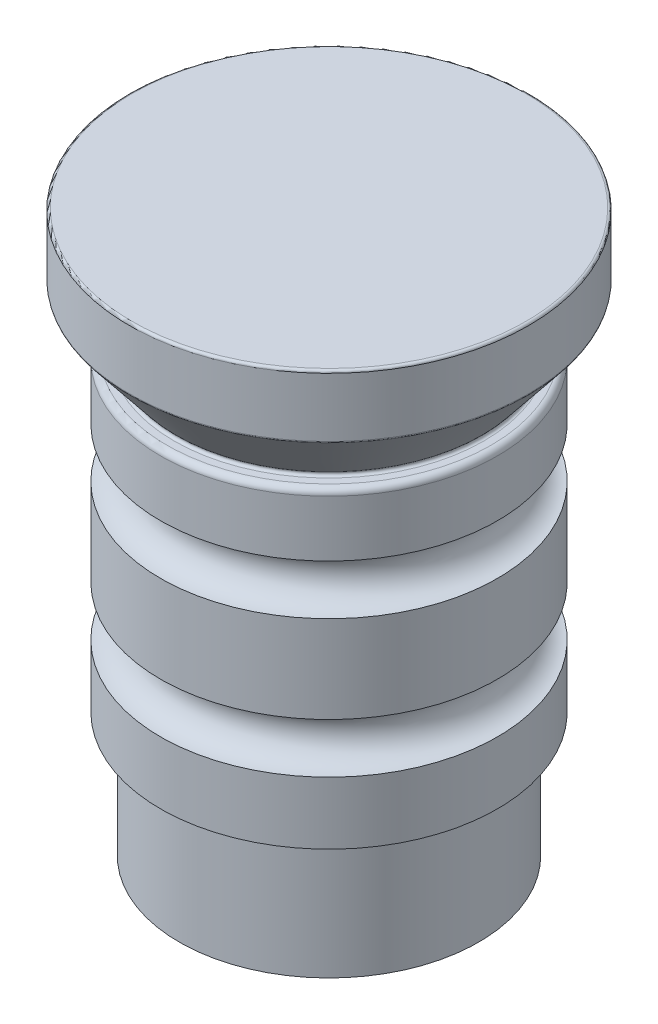
ISO-10303-21;
HEADER;
FILE_DESCRIPTION(('STEP AP214'),'2;1');
FILE_NAME('part.step','',(''),(''),'','','');
FILE_SCHEMA(('AUTOMOTIVE_DESIGN { 1 0 10303 214 1 1 1 1 }'));
ENDSEC;
DATA;
#1=APPLICATION_CONTEXT('core data for automotive mechanical design processes');
#2=APPLICATION_PROTOCOL_DEFINITION('international standard','automotive_design',2000,#1);
#3=PRODUCT_CONTEXT('',#1,'mechanical');
#4=PRODUCT('Part','Part','',(#3));
#5=PRODUCT_RELATED_PRODUCT_CATEGORY('part','',(#4));
#6=PRODUCT_DEFINITION_FORMATION('','',#4);
#7=PRODUCT_DEFINITION_CONTEXT('part definition',#1,'design');
#8=PRODUCT_DEFINITION('design','',#6,#7);
#9=PRODUCT_DEFINITION_SHAPE('','',#8);
#10=(LENGTH_UNIT() NAMED_UNIT(*) SI_UNIT(.MILLI.,.METRE.));
#11=(NAMED_UNIT(*) PLANE_ANGLE_UNIT() SI_UNIT($,.RADIAN.));
#12=(NAMED_UNIT(*) SI_UNIT($,.STERADIAN.) SOLID_ANGLE_UNIT());
#13=UNCERTAINTY_MEASURE_WITH_UNIT(LENGTH_MEASURE(1.E-05),#10,'distance_accuracy_value','');
#14=(GEOMETRIC_REPRESENTATION_CONTEXT(3) GLOBAL_UNCERTAINTY_ASSIGNED_CONTEXT((#13)) GLOBAL_UNIT_ASSIGNED_CONTEXT((#10,
#11,#12)) REPRESENTATION_CONTEXT('',''));
#15=CARTESIAN_POINT('',(0.,0.,0.));
#16=DIRECTION('',(0.,0.,1.));
#17=DIRECTION('',(1.,0.,0.));
#18=AXIS2_PLACEMENT_3D('',#15,#16,#17);
#19=CARTESIAN_POINT('',(-16.,45.,0.));
#20=DIRECTION('',(0.,1.,0.));
#21=DIRECTION('',(-1.,0.,0.));
#22=AXIS2_PLACEMENT_3D('',#19,#20,#21);
#23=PLANE('',#22);
#24=CARTESIAN_POINT('',(0.,45.,0.));
#25=DIRECTION('',(0.,1.,0.));
#26=DIRECTION('',(-1.,0.,0.));
#27=AXIS2_PLACEMENT_3D('',#24,#25,#26);
#28=CIRCLE('',#27,15.8);
#29=CARTESIAN_POINT('',(-15.8,45.,0.));
#30=VERTEX_POINT('',#29);
#31=EDGE_CURVE('E83',#30,#30,#28,.T.);
#32=ORIENTED_EDGE('',*,*,#31,.T.);
#33=EDGE_LOOP('',(#32));
#34=FACE_BOUND('',#33,.T.);
#35=ADVANCED_FACE('F39',(#34),#23,.T.);
#36=CARTESIAN_POINT('',(0.,4.,0.));
#37=DIRECTION('',(0.,-1.,0.));
#38=DIRECTION('',(1.,0.,0.));
#39=AXIS2_PLACEMENT_3D('',#36,#37,#38);
#40=PLANE('',#39);
#41=CARTESIAN_POINT('',(0.,4.,0.));
#42=DIRECTION('',(0.,-1.,0.));
#43=DIRECTION('',(1.,0.,0.));
#44=AXIS2_PLACEMENT_3D('',#41,#42,#43);
#45=CIRCLE('',#44,7.3);
#46=CARTESIAN_POINT('',(7.3,4.,0.));
#47=VERTEX_POINT('',#46);
#48=EDGE_CURVE('E57',#47,#47,#45,.T.);
#49=ORIENTED_EDGE('',*,*,#48,.T.);
#50=EDGE_LOOP('',(#49));
#51=FACE_BOUND('',#50,.T.);
#52=ADVANCED_FACE('F150',(#51),#40,.T.);
#53=CARTESIAN_POINT('',(0.,35.,0.));
#54=DIRECTION('',(0.,1.,0.));
#55=DIRECTION('',(-1.,0.,0.));
#56=AXIS2_PLACEMENT_3D('',#53,#54,#55);
#57=CYLINDRICAL_SURFACE('',#56,7.5);
#58=CARTESIAN_POINT('',(0.,4.2,0.));
#59=DIRECTION('',(0.,-1.,0.));
#60=DIRECTION('',(1.,0.,0.));
#61=AXIS2_PLACEMENT_3D('',#58,#59,#60);
#62=CIRCLE('',#61,7.5);
#63=CARTESIAN_POINT('',(7.5,4.2,0.));
#64=VERTEX_POINT('',#63);
#65=EDGE_CURVE('E63',#64,#64,#62,.F.);
#66=ORIENTED_EDGE('',*,*,#65,.T.);
#67=EDGE_LOOP('',(#66));
#68=FACE_BOUND('',#67,.T.);
#69=CARTESIAN_POINT('',(0.,5.,0.));
#70=DIRECTION('',(0.,1.,0.));
#71=DIRECTION('',(-1.,0.,0.));
#72=AXIS2_PLACEMENT_3D('',#69,#70,#71);
#73=CIRCLE('',#72,7.5);
#74=CARTESIAN_POINT('',(-7.5,5.,0.));
#75=VERTEX_POINT('',#74);
#76=EDGE_CURVE('E95',#75,#75,#73,.T.);
#77=ORIENTED_EDGE('',*,*,#76,.F.);
#78=EDGE_LOOP('',(#77));
#79=FACE_BOUND('',#78,.T.);
#80=ADVANCED_FACE('F156',(#68,#79),#57,.T.);
#81=CARTESIAN_POINT('',(-7.5,5.,0.));
#82=DIRECTION('',(0.,-1.,0.));
#83=DIRECTION('',(1.,0.,0.));
#84=AXIS2_PLACEMENT_3D('',#81,#82,#83);
#85=PLANE('',#84);
#86=CARTESIAN_POINT('',(0.,5.,0.));
#87=DIRECTION('',(0.,-1.,0.));
#88=DIRECTION('',(1.,0.,0.));
#89=AXIS2_PLACEMENT_3D('',#86,#87,#88);
#90=CIRCLE('',#89,9.8);
#91=CARTESIAN_POINT('',(9.8,5.,0.));
#92=VERTEX_POINT('',#91);
#93=EDGE_CURVE('E47',#92,#92,#90,.T.);
#94=ORIENTED_EDGE('',*,*,#93,.T.);
#95=EDGE_LOOP('',(#94));
#96=FACE_BOUND('',#95,.T.);
#97=ORIENTED_EDGE('',*,*,#76,.T.);
#98=EDGE_LOOP('',(#97));
#99=FACE_BOUND('',#98,.T.);
#100=ADVANCED_FACE('F191',(#96,#99),#85,.T.);
#101=CARTESIAN_POINT('',(0.,35.,0.));
#102=DIRECTION('',(0.,1.,0.));
#103=DIRECTION('',(-1.,0.,0.));
#104=AXIS2_PLACEMENT_3D('',#101,#102,#103);
#105=CYLINDRICAL_SURFACE('',#104,10.);
#106=CARTESIAN_POINT('',(0.,4.8,0.));
#107=DIRECTION('',(0.,-1.,0.));
#108=DIRECTION('',(1.,0.,0.));
#109=AXIS2_PLACEMENT_3D('',#106,#107,#108);
#110=CIRCLE('',#109,10.);
#111=CARTESIAN_POINT('',(10.,4.8,0.));
#112=VERTEX_POINT('',#111);
#113=EDGE_CURVE('E52',#112,#112,#110,.F.);
#114=ORIENTED_EDGE('',*,*,#113,.T.);
#115=EDGE_LOOP('',(#114));
#116=FACE_BOUND('',#115,.T.);
#117=CARTESIAN_POINT('',(0.,0.,0.));
#118=DIRECTION('',(0.,1.,0.));
#119=DIRECTION('',(-1.,0.,0.));
#120=AXIS2_PLACEMENT_3D('',#117,#118,#119);
#121=CIRCLE('',#120,10.);
#122=CARTESIAN_POINT('',(-10.,0.,0.));
#123=VERTEX_POINT('',#122);
#124=EDGE_CURVE('E99',#123,#123,#121,.T.);
#125=ORIENTED_EDGE('',*,*,#124,.F.);
#126=EDGE_LOOP('',(#125));
#127=FACE_BOUND('',#126,.T.);
#128=ADVANCED_FACE('F187',(#116,#127),#105,.F.);
#129=CARTESIAN_POINT('',(-10.,0.,0.));
#130=DIRECTION('',(0.,-1.,0.));
#131=DIRECTION('',(1.,0.,0.));
#132=AXIS2_PLACEMENT_3D('',#129,#130,#131);
#133=PLANE('',#132);
#134=ORIENTED_EDGE('',*,*,#124,.T.);
#135=EDGE_LOOP('',(#134));
#136=FACE_BOUND('',#135,.T.);
#137=CARTESIAN_POINT('',(0.,0.,0.));
#138=DIRECTION('',(0.,1.,0.));
#139=DIRECTION('',(-1.,0.,0.));
#140=AXIS2_PLACEMENT_3D('',#137,#138,#139);
#141=CIRCLE('',#140,12.);
#142=CARTESIAN_POINT('',(-12.,0.,0.));
#143=VERTEX_POINT('',#142);
#144=EDGE_CURVE('E103',#143,#143,#141,.T.);
#145=ORIENTED_EDGE('',*,*,#144,.F.);
#146=EDGE_LOOP('',(#145));
#147=FACE_BOUND('',#146,.T.);
#148=ADVANCED_FACE('F190',(#136,#147),#133,.T.);
#149=CARTESIAN_POINT('',(0.,35.,0.));
#150=DIRECTION('',(0.,1.,0.));
#151=DIRECTION('',(-1.,0.,0.));
#152=AXIS2_PLACEMENT_3D('',#149,#150,#151);
#153=CYLINDRICAL_SURFACE('',#152,12.);
#154=ORIENTED_EDGE('',*,*,#144,.T.);
#155=EDGE_LOOP('',(#154));
#156=FACE_BOUND('',#155,.T.);
#157=CARTESIAN_POINT('',(0.,10.,0.));
#158=DIRECTION('',(0.,1.,0.));
#159=DIRECTION('',(-1.,0.,0.));
#160=AXIS2_PLACEMENT_3D('',#157,#158,#159);
#161=CIRCLE('',#160,12.);
#162=CARTESIAN_POINT('',(-12.,10.,0.));
#163=VERTEX_POINT('',#162);
#164=EDGE_CURVE('E107',#163,#163,#161,.T.);
#165=ORIENTED_EDGE('',*,*,#164,.F.);
#166=EDGE_LOOP('',(#165));
#167=FACE_BOUND('',#166,.T.);
#168=ADVANCED_FACE('F197',(#156,#167),#153,.T.);
#169=CARTESIAN_POINT('',(-12.,10.,0.));
#170=DIRECTION('',(0.,-1.,0.));
#171=DIRECTION('',(1.,0.,0.));
#172=AXIS2_PLACEMENT_3D('',#169,#170,#171);
#173=PLANE('',#172);
#174=ORIENTED_EDGE('',*,*,#164,.T.);
#175=EDGE_LOOP('',(#174));
#176=FACE_BOUND('',#175,.T.);
#177=CARTESIAN_POINT('',(0.,10.,0.));
#178=DIRECTION('',(0.,1.,0.));
#179=DIRECTION('',(-1.,0.,0.));
#180=AXIS2_PLACEMENT_3D('',#177,#178,#179);
#181=CIRCLE('',#180,13.5);
#182=CARTESIAN_POINT('',(-13.5,10.,0.));
#183=VERTEX_POINT('',#182);
#184=EDGE_CURVE('E111',#183,#183,#181,.T.);
#185=ORIENTED_EDGE('',*,*,#184,.F.);
#186=EDGE_LOOP('',(#185));
#187=FACE_BOUND('',#186,.T.);
#188=ADVANCED_FACE('F203',(#176,#187),#173,.T.);
#189=CARTESIAN_POINT('',(0.,35.,0.));
#190=DIRECTION('',(0.,1.,0.));
#191=DIRECTION('',(-1.,0.,0.));
#192=AXIS2_PLACEMENT_3D('',#189,#190,#191);
#193=CYLINDRICAL_SURFACE('',#192,13.5);
#194=ORIENTED_EDGE('',*,*,#184,.T.);
#195=EDGE_LOOP('',(#194));
#196=FACE_BOUND('',#195,.T.);
#197=CARTESIAN_POINT('',(0.,15.,0.));
#198=DIRECTION('',(0.,1.,0.));
#199=DIRECTION('',(-1.,0.,0.));
#200=AXIS2_PLACEMENT_3D('',#197,#198,#199);
#201=CIRCLE('',#200,13.5);
#202=CARTESIAN_POINT('',(-13.5,15.,0.));
#203=VERTEX_POINT('',#202);
#204=EDGE_CURVE('E115',#203,#203,#201,.T.);
#205=ORIENTED_EDGE('',*,*,#204,.F.);
#206=EDGE_LOOP('',(#205));
#207=FACE_BOUND('',#206,.T.);
#208=ADVANCED_FACE('F209',(#196,#207),#193,.T.);
#209=CARTESIAN_POINT('',(0.,17.,0.));
#210=DIRECTION('',(0.,1.,0.));
#211=DIRECTION('',(-1.,0.,0.));
#212=AXIS2_PLACEMENT_3D('',#209,#210,#211);
#213=TOROIDAL_SURFACE('',#212,13.5,2.);
#214=ORIENTED_EDGE('',*,*,#204,.T.);
#215=EDGE_LOOP('',(#214));
#216=FACE_BOUND('',#215,.T.);
#217=CARTESIAN_POINT('',(0.,19.,0.));
#218=DIRECTION('',(0.,1.,0.));
#219=DIRECTION('',(-1.,0.,0.));
#220=AXIS2_PLACEMENT_3D('',#217,#218,#219);
#221=CIRCLE('',#220,13.5);
#222=CARTESIAN_POINT('',(-13.5,19.,0.));
#223=VERTEX_POINT('',#222);
#224=EDGE_CURVE('E119',#223,#223,#221,.T.);
#225=ORIENTED_EDGE('',*,*,#224,.F.);
#226=EDGE_LOOP('',(#225));
#227=FACE_BOUND('',#226,.T.);
#228=ADVANCED_FACE('F146',(#216,#227),#213,.F.);
#229=CARTESIAN_POINT('',(0.,35.,0.));
#230=DIRECTION('',(0.,1.,0.));
#231=DIRECTION('',(-1.,0.,0.));
#232=AXIS2_PLACEMENT_3D('',#229,#230,#231);
#233=CYLINDRICAL_SURFACE('',#232,13.5);
#234=ORIENTED_EDGE('',*,*,#224,.T.);
#235=EDGE_LOOP('',(#234));
#236=FACE_BOUND('',#235,.T.);
#237=CARTESIAN_POINT('',(0.,26.,0.));
#238=DIRECTION('',(0.,1.,0.));
#239=DIRECTION('',(-1.,0.,0.));
#240=AXIS2_PLACEMENT_3D('',#237,#238,#239);
#241=CIRCLE('',#240,13.5);
#242=CARTESIAN_POINT('',(-13.5,26.,0.));
#243=VERTEX_POINT('',#242);
#244=EDGE_CURVE('E123',#243,#243,#241,.T.);
#245=ORIENTED_EDGE('',*,*,#244,.F.);
#246=EDGE_LOOP('',(#245));
#247=FACE_BOUND('',#246,.T.);
#248=ADVANCED_FACE('F136',(#236,#247),#233,.T.);
#249=CARTESIAN_POINT('',(0.,28.,0.));
#250=DIRECTION('',(0.,1.,0.));
#251=DIRECTION('',(-1.,0.,0.));
#252=AXIS2_PLACEMENT_3D('',#249,#250,#251);
#253=TOROIDAL_SURFACE('',#252,13.5,2.);
#254=ORIENTED_EDGE('',*,*,#244,.T.);
#255=EDGE_LOOP('',(#254));
#256=FACE_BOUND('',#255,.T.);
#257=CARTESIAN_POINT('',(0.,30.,0.));
#258=DIRECTION('',(0.,1.,0.));
#259=DIRECTION('',(-1.,0.,0.));
#260=AXIS2_PLACEMENT_3D('',#257,#258,#259);
#261=CIRCLE('',#260,13.5);
#262=CARTESIAN_POINT('',(-13.5,30.,0.));
#263=VERTEX_POINT('',#262);
#264=EDGE_CURVE('E127',#263,#263,#261,.T.);
#265=ORIENTED_EDGE('',*,*,#264,.F.);
#266=EDGE_LOOP('',(#265));
#267=FACE_BOUND('',#266,.T.);
#268=ADVANCED_FACE('F134',(#256,#267),#253,.F.);
#269=CARTESIAN_POINT('',(0.,35.,0.));
#270=DIRECTION('',(0.,1.,0.));
#271=DIRECTION('',(-1.,0.,0.));
#272=AXIS2_PLACEMENT_3D('',#269,#270,#271);
#273=CYLINDRICAL_SURFACE('',#272,13.5);
#274=CARTESIAN_POINT('',(0.,34.5,0.));
#275=DIRECTION('',(0.,1.,0.));
#276=DIRECTION('',(-1.,0.,0.));
#277=AXIS2_PLACEMENT_3D('',#274,#275,#276);
#278=CIRCLE('',#277,13.5);
#279=CARTESIAN_POINT('',(-13.5,34.5,0.));
#280=VERTEX_POINT('',#279);
#281=EDGE_CURVE('E87',#280,#280,#278,.F.);
#282=ORIENTED_EDGE('',*,*,#281,.T.);
#283=EDGE_LOOP('',(#282));
#284=FACE_BOUND('',#283,.T.);
#285=ORIENTED_EDGE('',*,*,#264,.T.);
#286=EDGE_LOOP('',(#285));
#287=FACE_BOUND('',#286,.T.);
#288=ADVANCED_FACE('F132',(#284,#287),#273,.T.);
#289=CARTESIAN_POINT('',(-13.5,35.,0.));
#290=DIRECTION('',(0.,1.,0.));
#291=DIRECTION('',(-1.,0.,0.));
#292=AXIS2_PLACEMENT_3D('',#289,#290,#291);
#293=PLANE('',#292);
#294=CARTESIAN_POINT('',(0.,35.,0.));
#295=DIRECTION('',(0.,1.,0.));
#296=DIRECTION('',(-1.,0.,0.));
#297=AXIS2_PLACEMENT_3D('',#294,#295,#296);
#298=CIRCLE('',#297,12.4161249694973);
#299=CARTESIAN_POINT('',(-12.4161249694973,35.,0.));
#300=VERTEX_POINT('',#299);
#301=EDGE_CURVE('E10',#300,#300,#298,.F.);
#302=ORIENTED_EDGE('',*,*,#301,.T.);
#303=EDGE_LOOP('',(#302));
#304=FACE_BOUND('',#303,.T.);
#305=CARTESIAN_POINT('',(0.,35.,0.));
#306=DIRECTION('',(0.,1.,0.));
#307=DIRECTION('',(-1.,0.,0.));
#308=AXIS2_PLACEMENT_3D('',#305,#306,#307);
#309=CIRCLE('',#308,13.);
#310=CARTESIAN_POINT('',(-13.,35.,0.));
#311=VERTEX_POINT('',#310);
#312=EDGE_CURVE('E91',#311,#311,#309,.T.);
#313=ORIENTED_EDGE('',*,*,#312,.T.);
#314=EDGE_LOOP('',(#313));
#315=FACE_BOUND('',#314,.T.);
#316=ADVANCED_FACE('F143',(#304,#315),#293,.T.);
#317=CARTESIAN_POINT('',(0.,40.,0.));
#318=DIRECTION('',(0.,1.,0.));
#319=DIRECTION('',(-1.,0.,0.));
#320=AXIS2_PLACEMENT_3D('',#317,#318,#319);
#321=CONICAL_SURFACE('',#320,16.,0.674740942223554);
#322=CARTESIAN_POINT('',(0.,39.9452172023607,0.));
#323=DIRECTION('',(0.,-1.,0.));
#324=DIRECTION('',(1.,0.,0.));
#325=AXIS2_PLACEMENT_3D('',#322,#323,#324);
#326=CIRCLE('',#325,15.9561737618886);
#327=CARTESIAN_POINT('',(15.9561737618886,39.9452172023607,0.));
#328=VERTEX_POINT('',#327);
#329=EDGE_CURVE('E67',#328,#328,#326,.T.);
#330=ORIENTED_EDGE('',*,*,#329,.T.);
#331=EDGE_LOOP('',(#330));
#332=FACE_BOUND('',#331,.T.);
#333=CARTESIAN_POINT('',(0.,35.3249390095109,0.));
#334=DIRECTION('',(0.,1.,0.));
#335=DIRECTION('',(-1.,0.,0.));
#336=AXIS2_PLACEMENT_3D('',#333,#334,#335);
#337=CIRCLE('',#336,12.2599512076087);
#338=CARTESIAN_POINT('',(-12.2599512076087,35.3249390095109,0.));
#339=VERTEX_POINT('',#338);
#340=EDGE_CURVE('E71',#339,#339,#337,.T.);
#341=ORIENTED_EDGE('',*,*,#340,.T.);
#342=EDGE_LOOP('',(#341));
#343=FACE_BOUND('',#342,.T.);
#344=ADVANCED_FACE('F351',(#332,#343),#321,.T.);
#345=CARTESIAN_POINT('',(0.,35.,0.));
#346=DIRECTION('',(0.,1.,0.));
#347=DIRECTION('',(-1.,0.,0.));
#348=AXIS2_PLACEMENT_3D('',#345,#346,#347);
#349=CYLINDRICAL_SURFACE('',#348,16.);
#350=CARTESIAN_POINT('',(0.,44.8,0.));
#351=DIRECTION('',(0.,1.,0.));
#352=DIRECTION('',(-1.,0.,0.));
#353=AXIS2_PLACEMENT_3D('',#350,#351,#352);
#354=CIRCLE('',#353,16.);
#355=CARTESIAN_POINT('',(-16.,44.8,0.));
#356=VERTEX_POINT('',#355);
#357=EDGE_CURVE('E75',#356,#356,#354,.F.);
#358=ORIENTED_EDGE('',*,*,#357,.T.);
#359=EDGE_LOOP('',(#358));
#360=FACE_BOUND('',#359,.T.);
#361=CARTESIAN_POINT('',(0.,40.0701562118716,0.));
#362=DIRECTION('',(0.,-1.,0.));
#363=DIRECTION('',(1.,0.,0.));
#364=AXIS2_PLACEMENT_3D('',#361,#362,#363);
#365=CIRCLE('',#364,16.);
#366=CARTESIAN_POINT('',(16.,40.0701562118716,0.));
#367=VERTEX_POINT('',#366);
#368=EDGE_CURVE('E79',#367,#367,#365,.F.);
#369=ORIENTED_EDGE('',*,*,#368,.T.);
#370=EDGE_LOOP('',(#369));
#371=FACE_BOUND('',#370,.T.);
#372=ADVANCED_FACE('F165',(#360,#371),#349,.T.);
#373=CARTESIAN_POINT('',(0.,34.5,0.));
#374=DIRECTION('',(0.,1.,0.));
#375=DIRECTION('',(-1.,0.,0.));
#376=AXIS2_PLACEMENT_3D('',#373,#374,#375);
#377=TOROIDAL_SURFACE('',#376,13.,0.5);
#378=ORIENTED_EDGE('',*,*,#281,.F.);
#379=EDGE_LOOP('',(#378));
#380=FACE_BOUND('',#379,.T.);
#381=ORIENTED_EDGE('',*,*,#312,.F.);
#382=EDGE_LOOP('',(#381));
#383=FACE_BOUND('',#382,.T.);
#384=ADVANCED_FACE('F161',(#380,#383),#377,.T.);
#385=CARTESIAN_POINT('',(0.,44.8,0.));
#386=DIRECTION('',(0.,1.,0.));
#387=DIRECTION('',(-1.,0.,0.));
#388=AXIS2_PLACEMENT_3D('',#385,#386,#387);
#389=TOROIDAL_SURFACE('',#388,15.8,0.2);
#390=ORIENTED_EDGE('',*,*,#357,.F.);
#391=EDGE_LOOP('',(#390));
#392=FACE_BOUND('',#391,.T.);
#393=ORIENTED_EDGE('',*,*,#31,.F.);
#394=EDGE_LOOP('',(#393));
#395=FACE_BOUND('',#394,.T.);
#396=ADVANCED_FACE('F164',(#392,#395),#389,.T.);
#397=CARTESIAN_POINT('',(0.,40.0701562118716,0.));
#398=DIRECTION('',(0.,-1.,0.));
#399=DIRECTION('',(1.,0.,0.));
#400=AXIS2_PLACEMENT_3D('',#397,#398,#399);
#401=TOROIDAL_SURFACE('',#400,15.8,0.2);
#402=ORIENTED_EDGE('',*,*,#329,.F.);
#403=EDGE_LOOP('',(#402));
#404=FACE_BOUND('',#403,.T.);
#405=ORIENTED_EDGE('',*,*,#368,.F.);
#406=EDGE_LOOP('',(#405));
#407=FACE_BOUND('',#406,.T.);
#408=ADVANCED_FACE('F169',(#404,#407),#401,.T.);
#409=CARTESIAN_POINT('',(0.,4.2,0.));
#410=DIRECTION('',(0.,-1.,0.));
#411=DIRECTION('',(1.,0.,0.));
#412=AXIS2_PLACEMENT_3D('',#409,#410,#411);
#413=TOROIDAL_SURFACE('',#412,7.3,0.2);
#414=ORIENTED_EDGE('',*,*,#48,.F.);
#415=EDGE_LOOP('',(#414));
#416=FACE_BOUND('',#415,.T.);
#417=ORIENTED_EDGE('',*,*,#65,.F.);
#418=EDGE_LOOP('',(#417));
#419=FACE_BOUND('',#418,.T.);
#420=ADVANCED_FACE('F173',(#416,#419),#413,.T.);
#421=CARTESIAN_POINT('',(0.,4.8,0.));
#422=DIRECTION('',(0.,-1.,0.));
#423=DIRECTION('',(1.,0.,0.));
#424=AXIS2_PLACEMENT_3D('',#421,#422,#423);
#425=TOROIDAL_SURFACE('',#424,9.8,0.2);
#426=ORIENTED_EDGE('',*,*,#93,.F.);
#427=EDGE_LOOP('',(#426));
#428=FACE_BOUND('',#427,.T.);
#429=ORIENTED_EDGE('',*,*,#113,.F.);
#430=EDGE_LOOP('',(#429));
#431=FACE_BOUND('',#430,.T.);
#432=ADVANCED_FACE('F176',(#428,#431),#425,.F.);
#433=CARTESIAN_POINT('',(0.,35.2,0.));
#434=DIRECTION('',(0.,1.,0.));
#435=DIRECTION('',(-1.,0.,0.));
#436=AXIS2_PLACEMENT_3D('',#433,#434,#435);
#437=TOROIDAL_SURFACE('',#436,12.4161249694973,0.2);
#438=ORIENTED_EDGE('',*,*,#301,.F.);
#439=EDGE_LOOP('',(#438));
#440=FACE_BOUND('',#439,.T.);
#441=ORIENTED_EDGE('',*,*,#340,.F.);
#442=EDGE_LOOP('',(#441));
#443=FACE_BOUND('',#442,.T.);
#444=ADVANCED_FACE('F41',(#440,#443),#437,.F.);
#445=CLOSED_SHELL('',(#35,#52,#80,#100,#128,#148,#168,#188,#208,#228,#248,#268,#288,#316,#344,
#372,#384,#396,#408,#420,#432,#444));
#446=MANIFOLD_SOLID_BREP('B2',#445);
#447=ADVANCED_BREP_SHAPE_REPRESENTATION('',(#18,#446),#14);
#448=SHAPE_DEFINITION_REPRESENTATION(#9,#447);
ENDSEC;
END-ISO-10303-21;
